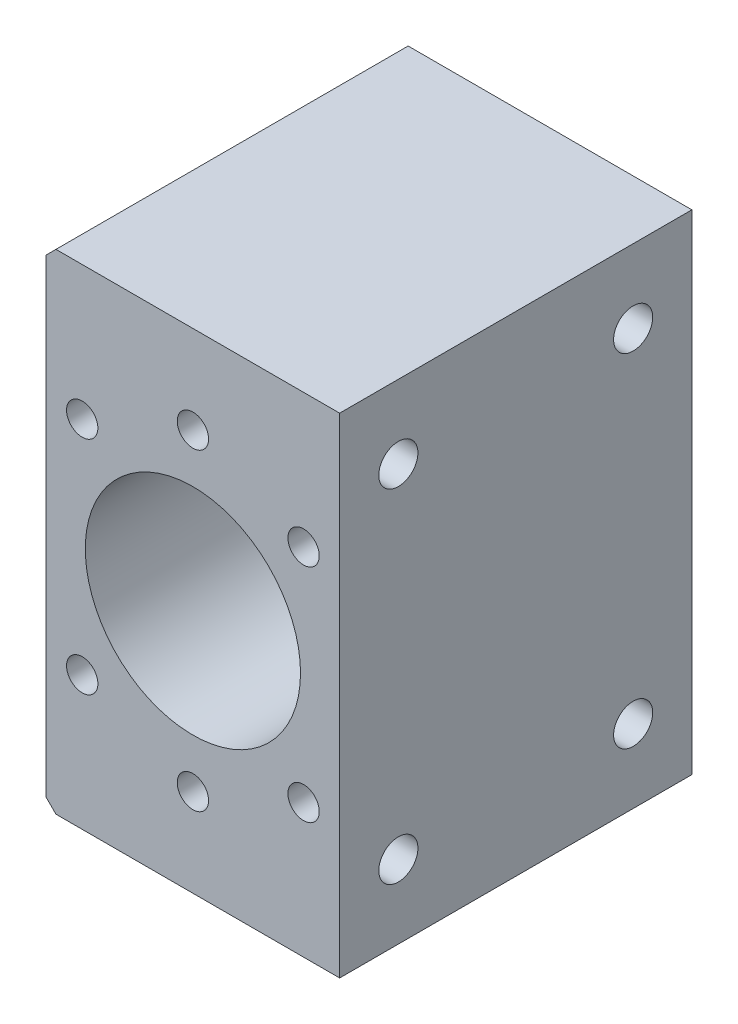
ISO-10303-21;
HEADER;
FILE_DESCRIPTION(('STEP AP214'),'2;1');
FILE_NAME('part.step','',(''),(''),'','','');
FILE_SCHEMA(('AUTOMOTIVE_DESIGN { 1 0 10303 214 1 1 1 1 }'));
ENDSEC;
DATA;
#1=APPLICATION_CONTEXT('core data for automotive mechanical design processes');
#2=APPLICATION_PROTOCOL_DEFINITION('international standard','automotive_design',2000,#1);
#3=PRODUCT_CONTEXT('',#1,'mechanical');
#4=PRODUCT('Part','Part','',(#3));
#5=PRODUCT_RELATED_PRODUCT_CATEGORY('part','',(#4));
#6=PRODUCT_DEFINITION_FORMATION('','',#4);
#7=PRODUCT_DEFINITION_CONTEXT('part definition',#1,'design');
#8=PRODUCT_DEFINITION('design','',#6,#7);
#9=PRODUCT_DEFINITION_SHAPE('','',#8);
#10=(LENGTH_UNIT() NAMED_UNIT(*) SI_UNIT(.MILLI.,.METRE.));
#11=(NAMED_UNIT(*) PLANE_ANGLE_UNIT() SI_UNIT($,.RADIAN.));
#12=(NAMED_UNIT(*) SI_UNIT($,.STERADIAN.) SOLID_ANGLE_UNIT());
#13=UNCERTAINTY_MEASURE_WITH_UNIT(LENGTH_MEASURE(1.E-05),#10,'distance_accuracy_value','');
#14=(GEOMETRIC_REPRESENTATION_CONTEXT(3) GLOBAL_UNCERTAINTY_ASSIGNED_CONTEXT((#13)) GLOBAL_UNIT_ASSIGNED_CONTEXT((#10,
#11,#12)) REPRESENTATION_CONTEXT('',''));
#15=CARTESIAN_POINT('',(0.,0.,0.));
#16=DIRECTION('',(0.,0.,1.));
#17=DIRECTION('',(1.,0.,0.));
#18=AXIS2_PLACEMENT_3D('',#15,#16,#17);
#19=CARTESIAN_POINT('',(-19.5,-19.5,36.));
#20=DIRECTION('',(-0.707106781186547,-0.707106781186547,0.));
#21=DIRECTION('',(0.707106781186548,-0.707106781186548,0.));
#22=AXIS2_PLACEMENT_3D('',#19,#20,#21);
#23=PLANE('',#22);
#24=DIRECTION('',(-0.707106781186548,0.707106781186548,0.));
#25=VECTOR('',#24,1.);
#26=CARTESIAN_POINT('',(-19.5,-19.5,0.));
#27=LINE('',#26,#25);
#28=CARTESIAN_POINT('',(-14.,-25.,0.));
#29=VERTEX_POINT('',#28);
#30=CARTESIAN_POINT('',(-15.,-24.,0.));
#31=VERTEX_POINT('',#30);
#32=EDGE_CURVE('E142',#29,#31,#27,.T.);
#33=ORIENTED_EDGE('',*,*,#32,.F.);
#34=DIRECTION('',(0.,0.,-1.));
#35=VECTOR('',#34,1.);
#36=CARTESIAN_POINT('',(-14.,-25.,36.));
#37=LINE('',#36,#35);
#38=CARTESIAN_POINT('',(-14.,-25.,36.));
#39=VERTEX_POINT('',#38);
#40=EDGE_CURVE('E11',#39,#29,#37,.T.);
#41=ORIENTED_EDGE('',*,*,#40,.F.);
#42=DIRECTION('',(-0.707106781186548,0.707106781186548,0.));
#43=VECTOR('',#42,1.);
#44=CARTESIAN_POINT('',(-19.5,-19.5,36.));
#45=LINE('',#44,#43);
#46=CARTESIAN_POINT('',(-15.,-24.,36.));
#47=VERTEX_POINT('',#46);
#48=EDGE_CURVE('E217',#39,#47,#45,.T.);
#49=ORIENTED_EDGE('',*,*,#48,.T.);
#50=DIRECTION('',(0.,0.,-1.));
#51=VECTOR('',#50,1.);
#52=CARTESIAN_POINT('',(-15.,-24.,36.));
#53=LINE('',#52,#51);
#54=EDGE_CURVE('E99',#47,#31,#53,.T.);
#55=ORIENTED_EDGE('',*,*,#54,.T.);
#56=EDGE_LOOP('',(#33,#41,#49,#55));
#57=FACE_BOUND('',#56,.T.);
#58=ADVANCED_FACE('F53',(#57),#23,.T.);
#59=CARTESIAN_POINT('',(0.,-25.,36.));
#60=DIRECTION('',(0.,1.,0.));
#61=DIRECTION('',(-1.,0.,0.));
#62=AXIS2_PLACEMENT_3D('',#59,#60,#61);
#63=PLANE('',#62);
#64=DIRECTION('',(1.,0.,0.));
#65=VECTOR('',#64,1.);
#66=CARTESIAN_POINT('',(0.,-25.,0.));
#67=LINE('',#66,#65);
#68=CARTESIAN_POINT('',(15.,-25.,0.));
#69=VERTEX_POINT('',#68);
#70=EDGE_CURVE('E145',#29,#69,#67,.T.);
#71=ORIENTED_EDGE('',*,*,#70,.T.);
#72=DIRECTION('',(0.,0.,-1.));
#73=VECTOR('',#72,1.);
#74=CARTESIAN_POINT('',(15.,-25.,36.));
#75=LINE('',#74,#73);
#76=CARTESIAN_POINT('',(15.,-25.,36.));
#77=VERTEX_POINT('',#76);
#78=EDGE_CURVE('E62',#77,#69,#75,.T.);
#79=ORIENTED_EDGE('',*,*,#78,.F.);
#80=DIRECTION('',(1.,0.,0.));
#81=VECTOR('',#80,1.);
#82=CARTESIAN_POINT('',(0.,-25.,36.));
#83=LINE('',#82,#81);
#84=EDGE_CURVE('E134',#39,#77,#83,.T.);
#85=ORIENTED_EDGE('',*,*,#84,.F.);
#86=ORIENTED_EDGE('',*,*,#40,.T.);
#87=EDGE_LOOP('',(#71,#79,#85,#86));
#88=FACE_BOUND('',#87,.T.);
#89=ADVANCED_FACE('F164',(#88),#63,.F.);
#90=CARTESIAN_POINT('',(15.,0.,36.));
#91=DIRECTION('',(1.,0.,0.));
#92=DIRECTION('',(0.,0.,-1.));
#93=AXIS2_PLACEMENT_3D('',#90,#91,#92);
#94=PLANE('',#93);
#95=CARTESIAN_POINT('',(15.,-17.5,5.99999999999999));
#96=DIRECTION('',(1.,0.,0.));
#97=DIRECTION('',(0.,0.,-1.));
#98=AXIS2_PLACEMENT_3D('',#95,#96,#97);
#99=CIRCLE('',#98,2.);
#100=CARTESIAN_POINT('',(15.,-17.5,3.99999999999999));
#101=VERTEX_POINT('',#100);
#102=EDGE_CURVE('E264',#101,#101,#99,.T.);
#103=ORIENTED_EDGE('',*,*,#102,.F.);
#104=EDGE_LOOP('',(#103));
#105=FACE_BOUND('',#104,.T.);
#106=CARTESIAN_POINT('',(15.,-17.5,30.));
#107=DIRECTION('',(1.,0.,0.));
#108=DIRECTION('',(0.,0.,-1.));
#109=AXIS2_PLACEMENT_3D('',#106,#107,#108);
#110=CIRCLE('',#109,2.);
#111=CARTESIAN_POINT('',(15.,-17.5,28.));
#112=VERTEX_POINT('',#111);
#113=EDGE_CURVE('E271',#112,#112,#110,.T.);
#114=ORIENTED_EDGE('',*,*,#113,.F.);
#115=EDGE_LOOP('',(#114));
#116=FACE_BOUND('',#115,.T.);
#117=CARTESIAN_POINT('',(15.,17.5,30.));
#118=DIRECTION('',(1.,0.,0.));
#119=DIRECTION('',(0.,0.,-1.));
#120=AXIS2_PLACEMENT_3D('',#117,#118,#119);
#121=CIRCLE('',#120,2.);
#122=CARTESIAN_POINT('',(15.,17.5,28.));
#123=VERTEX_POINT('',#122);
#124=EDGE_CURVE('E277',#123,#123,#121,.T.);
#125=ORIENTED_EDGE('',*,*,#124,.F.);
#126=EDGE_LOOP('',(#125));
#127=FACE_BOUND('',#126,.T.);
#128=CARTESIAN_POINT('',(15.,17.5,5.99999999999999));
#129=DIRECTION('',(1.,0.,0.));
#130=DIRECTION('',(0.,0.,-1.));
#131=AXIS2_PLACEMENT_3D('',#128,#129,#130);
#132=CIRCLE('',#131,2.);
#133=CARTESIAN_POINT('',(15.,17.5,3.99999999999999));
#134=VERTEX_POINT('',#133);
#135=EDGE_CURVE('E258',#134,#134,#132,.T.);
#136=ORIENTED_EDGE('',*,*,#135,.F.);
#137=EDGE_LOOP('',(#136));
#138=FACE_BOUND('',#137,.T.);
#139=DIRECTION('',(0.,-1.,0.));
#140=VECTOR('',#139,1.);
#141=CARTESIAN_POINT('',(15.,0.,0.));
#142=LINE('',#141,#140);
#143=CARTESIAN_POINT('',(15.,25.,0.));
#144=VERTEX_POINT('',#143);
#145=EDGE_CURVE('E148',#144,#69,#142,.T.);
#146=ORIENTED_EDGE('',*,*,#145,.F.);
#147=DIRECTION('',(0.,0.,-1.));
#148=VECTOR('',#147,1.);
#149=CARTESIAN_POINT('',(15.,25.,36.));
#150=LINE('',#149,#148);
#151=CARTESIAN_POINT('',(15.,25.,36.));
#152=VERTEX_POINT('',#151);
#153=EDGE_CURVE('E122',#152,#144,#150,.T.);
#154=ORIENTED_EDGE('',*,*,#153,.F.);
#155=DIRECTION('',(0.,-1.,0.));
#156=VECTOR('',#155,1.);
#157=CARTESIAN_POINT('',(15.,0.,36.));
#158=LINE('',#157,#156);
#159=EDGE_CURVE('E132',#152,#77,#158,.T.);
#160=ORIENTED_EDGE('',*,*,#159,.T.);
#161=ORIENTED_EDGE('',*,*,#78,.T.);
#162=EDGE_LOOP('',(#146,#154,#160,#161));
#163=FACE_BOUND('',#162,.T.);
#164=ADVANCED_FACE('F161',(#105,#116,#127,#138,#163),#94,.T.);
#165=CARTESIAN_POINT('',(0.,25.,36.));
#166=DIRECTION('',(0.,1.,0.));
#167=DIRECTION('',(-1.,0.,0.));
#168=AXIS2_PLACEMENT_3D('',#165,#166,#167);
#169=PLANE('',#168);
#170=DIRECTION('',(1.,0.,0.));
#171=VECTOR('',#170,1.);
#172=CARTESIAN_POINT('',(0.,25.,0.));
#173=LINE('',#172,#171);
#174=CARTESIAN_POINT('',(-14.,25.,0.));
#175=VERTEX_POINT('',#174);
#176=EDGE_CURVE('E119',#175,#144,#173,.T.);
#177=ORIENTED_EDGE('',*,*,#176,.F.);
#178=DIRECTION('',(0.,0.,-1.));
#179=VECTOR('',#178,1.);
#180=CARTESIAN_POINT('',(-14.,25.,36.));
#181=LINE('',#180,#179);
#182=CARTESIAN_POINT('',(-14.,25.,36.));
#183=VERTEX_POINT('',#182);
#184=EDGE_CURVE('E113',#183,#175,#181,.T.);
#185=ORIENTED_EDGE('',*,*,#184,.F.);
#186=DIRECTION('',(1.,0.,0.));
#187=VECTOR('',#186,1.);
#188=CARTESIAN_POINT('',(0.,25.,36.));
#189=LINE('',#188,#187);
#190=EDGE_CURVE('E117',#183,#152,#189,.T.);
#191=ORIENTED_EDGE('',*,*,#190,.T.);
#192=ORIENTED_EDGE('',*,*,#153,.T.);
#193=EDGE_LOOP('',(#177,#185,#191,#192));
#194=FACE_BOUND('',#193,.T.);
#195=ADVANCED_FACE('F115',(#194),#169,.T.);
#196=CARTESIAN_POINT('',(-19.5,19.5,36.));
#197=DIRECTION('',(0.707106781186547,-0.707106781186547,0.));
#198=DIRECTION('',(0.707106781186548,0.707106781186548,0.));
#199=AXIS2_PLACEMENT_3D('',#196,#197,#198);
#200=PLANE('',#199);
#201=DIRECTION('',(-0.707106781186548,-0.707106781186548,0.));
#202=VECTOR('',#201,1.);
#203=CARTESIAN_POINT('',(-19.5,19.5,0.));
#204=LINE('',#203,#202);
#205=CARTESIAN_POINT('',(-15.,24.,0.));
#206=VERTEX_POINT('',#205);
#207=EDGE_CURVE('E152',#175,#206,#204,.T.);
#208=ORIENTED_EDGE('',*,*,#207,.T.);
#209=DIRECTION('',(0.,0.,-1.));
#210=VECTOR('',#209,1.);
#211=CARTESIAN_POINT('',(-15.,24.,36.));
#212=LINE('',#211,#210);
#213=CARTESIAN_POINT('',(-15.,24.,36.));
#214=VERTEX_POINT('',#213);
#215=EDGE_CURVE('E123',#214,#206,#212,.T.);
#216=ORIENTED_EDGE('',*,*,#215,.F.);
#217=DIRECTION('',(-0.707106781186548,-0.707106781186548,0.));
#218=VECTOR('',#217,1.);
#219=CARTESIAN_POINT('',(-19.5,19.5,36.));
#220=LINE('',#219,#218);
#221=EDGE_CURVE('E126',#183,#214,#220,.T.);
#222=ORIENTED_EDGE('',*,*,#221,.F.);
#223=ORIENTED_EDGE('',*,*,#184,.T.);
#224=EDGE_LOOP('',(#208,#216,#222,#223));
#225=FACE_BOUND('',#224,.T.);
#226=ADVANCED_FACE('F127',(#225),#200,.F.);
#227=CARTESIAN_POINT('',(0.,0.,36.));
#228=DIRECTION('',(0.,0.,-1.));
#229=DIRECTION('',(-1.,0.,0.));
#230=AXIS2_PLACEMENT_3D('',#227,#228,#229);
#231=CYLINDRICAL_SURFACE('',#230,11.);
#232=CARTESIAN_POINT('',(0.,0.,36.));
#233=DIRECTION('',(0.,0.,1.));
#234=DIRECTION('',(1.,0.,0.));
#235=AXIS2_PLACEMENT_3D('',#232,#233,#234);
#236=CIRCLE('',#235,11.);
#237=CARTESIAN_POINT('',(11.,0.,36.));
#238=VERTEX_POINT('',#237);
#239=EDGE_CURVE('E155',#238,#238,#236,.T.);
#240=ORIENTED_EDGE('',*,*,#239,.T.);
#241=EDGE_LOOP('',(#240));
#242=FACE_BOUND('',#241,.T.);
#243=CARTESIAN_POINT('',(0.,0.,0.));
#244=DIRECTION('',(0.,0.,1.));
#245=DIRECTION('',(1.,0.,0.));
#246=AXIS2_PLACEMENT_3D('',#243,#244,#245);
#247=CIRCLE('',#246,11.);
#248=CARTESIAN_POINT('',(11.,0.,0.));
#249=VERTEX_POINT('',#248);
#250=EDGE_CURVE('E139',#249,#249,#247,.T.);
#251=ORIENTED_EDGE('',*,*,#250,.F.);
#252=EDGE_LOOP('',(#251));
#253=FACE_BOUND('',#252,.T.);
#254=ADVANCED_FACE('F55',(#242,#253),#231,.F.);
#255=CARTESIAN_POINT('',(-15.,0.,36.));
#256=DIRECTION('',(1.,0.,0.));
#257=DIRECTION('',(0.,0.,-1.));
#258=AXIS2_PLACEMENT_3D('',#255,#256,#257);
#259=PLANE('',#258);
#260=CARTESIAN_POINT('',(-15.,17.5,30.));
#261=DIRECTION('',(-1.,0.,0.));
#262=DIRECTION('',(0.,0.,1.));
#263=AXIS2_PLACEMENT_3D('',#260,#261,#262);
#264=CIRCLE('',#263,1.2);
#265=CARTESIAN_POINT('',(-15.,17.5,31.2));
#266=VERTEX_POINT('',#265);
#267=EDGE_CURVE('E204',#266,#266,#264,.T.);
#268=ORIENTED_EDGE('',*,*,#267,.F.);
#269=EDGE_LOOP('',(#268));
#270=FACE_BOUND('',#269,.T.);
#271=CARTESIAN_POINT('',(-15.,-17.5,5.99999999999999));
#272=DIRECTION('',(-1.,0.,0.));
#273=DIRECTION('',(0.,0.,1.));
#274=AXIS2_PLACEMENT_3D('',#271,#272,#273);
#275=CIRCLE('',#274,1.2);
#276=CARTESIAN_POINT('',(-15.,-17.5,7.19999999999999));
#277=VERTEX_POINT('',#276);
#278=EDGE_CURVE('E208',#277,#277,#275,.T.);
#279=ORIENTED_EDGE('',*,*,#278,.F.);
#280=EDGE_LOOP('',(#279));
#281=FACE_BOUND('',#280,.T.);
#282=CARTESIAN_POINT('',(-15.,-17.5,30.));
#283=DIRECTION('',(-1.,0.,0.));
#284=DIRECTION('',(0.,0.,1.));
#285=AXIS2_PLACEMENT_3D('',#282,#283,#284);
#286=CIRCLE('',#285,1.2);
#287=CARTESIAN_POINT('',(-15.,-17.5,31.2));
#288=VERTEX_POINT('',#287);
#289=EDGE_CURVE('E212',#288,#288,#286,.T.);
#290=ORIENTED_EDGE('',*,*,#289,.F.);
#291=EDGE_LOOP('',(#290));
#292=FACE_BOUND('',#291,.T.);
#293=CARTESIAN_POINT('',(-15.,17.5,5.99999999999999));
#294=DIRECTION('',(-1.,0.,0.));
#295=DIRECTION('',(0.,0.,1.));
#296=AXIS2_PLACEMENT_3D('',#293,#294,#295);
#297=CIRCLE('',#296,1.2);
#298=CARTESIAN_POINT('',(-15.,17.5,7.19999999999999));
#299=VERTEX_POINT('',#298);
#300=EDGE_CURVE('E216',#299,#299,#297,.T.);
#301=ORIENTED_EDGE('',*,*,#300,.F.);
#302=EDGE_LOOP('',(#301));
#303=FACE_BOUND('',#302,.T.);
#304=DIRECTION('',(0.,-1.,0.));
#305=VECTOR('',#304,1.);
#306=CARTESIAN_POINT('',(-15.,0.,0.));
#307=LINE('',#306,#305);
#308=EDGE_CURVE('E92',#206,#31,#307,.T.);
#309=ORIENTED_EDGE('',*,*,#308,.T.);
#310=ORIENTED_EDGE('',*,*,#54,.F.);
#311=DIRECTION('',(0.,-1.,0.));
#312=VECTOR('',#311,1.);
#313=CARTESIAN_POINT('',(-15.,0.,36.));
#314=LINE('',#313,#312);
#315=EDGE_CURVE('E70',#214,#47,#314,.T.);
#316=ORIENTED_EDGE('',*,*,#315,.F.);
#317=ORIENTED_EDGE('',*,*,#215,.T.);
#318=EDGE_LOOP('',(#309,#310,#316,#317));
#319=FACE_BOUND('',#318,.T.);
#320=ADVANCED_FACE('F178',(#270,#281,#292,#303,#319),#259,.F.);
#321=CARTESIAN_POINT('',(0.,0.,36.));
#322=DIRECTION('',(0.,0.,1.));
#323=DIRECTION('',(1.,0.,0.));
#324=AXIS2_PLACEMENT_3D('',#321,#322,#323);
#325=PLANE('',#324);
#326=CARTESIAN_POINT('',(0.,16.,36.));
#327=DIRECTION('',(0.,0.,1.));
#328=DIRECTION('',(1.,0.,0.));
#329=AXIS2_PLACEMENT_3D('',#326,#327,#328);
#330=CIRCLE('',#329,1.6);
#331=CARTESIAN_POINT('',(1.6,16.,36.));
#332=VERTEX_POINT('',#331);
#333=EDGE_CURVE('E247',#332,#332,#330,.T.);
#334=ORIENTED_EDGE('',*,*,#333,.F.);
#335=EDGE_LOOP('',(#334));
#336=FACE_BOUND('',#335,.T.);
#337=CARTESIAN_POINT('',(-11.3137084989848,11.3137084989848,36.));
#338=DIRECTION('',(0.,0.,1.));
#339=DIRECTION('',(1.,0.,0.));
#340=AXIS2_PLACEMENT_3D('',#337,#338,#339);
#341=CIRCLE('',#340,1.6);
#342=CARTESIAN_POINT('',(-9.71370849898476,11.3137084989848,36.));
#343=VERTEX_POINT('',#342);
#344=EDGE_CURVE('E248',#343,#343,#341,.T.);
#345=ORIENTED_EDGE('',*,*,#344,.F.);
#346=EDGE_LOOP('',(#345));
#347=FACE_BOUND('',#346,.T.);
#348=CARTESIAN_POINT('',(-11.3137084989848,-11.3137084989848,36.));
#349=DIRECTION('',(0.,0.,1.));
#350=DIRECTION('',(1.,0.,0.));
#351=AXIS2_PLACEMENT_3D('',#348,#349,#350);
#352=CIRCLE('',#351,1.6);
#353=CARTESIAN_POINT('',(-9.71370849898476,-11.3137084989848,36.));
#354=VERTEX_POINT('',#353);
#355=EDGE_CURVE('E222',#354,#354,#352,.T.);
#356=ORIENTED_EDGE('',*,*,#355,.F.);
#357=EDGE_LOOP('',(#356));
#358=FACE_BOUND('',#357,.T.);
#359=CARTESIAN_POINT('',(0.,-16.,36.));
#360=DIRECTION('',(0.,0.,1.));
#361=DIRECTION('',(1.,0.,0.));
#362=AXIS2_PLACEMENT_3D('',#359,#360,#361);
#363=CIRCLE('',#362,1.6);
#364=CARTESIAN_POINT('',(1.6,-16.,36.));
#365=VERTEX_POINT('',#364);
#366=EDGE_CURVE('E229',#365,#365,#363,.T.);
#367=ORIENTED_EDGE('',*,*,#366,.F.);
#368=EDGE_LOOP('',(#367));
#369=FACE_BOUND('',#368,.T.);
#370=CARTESIAN_POINT('',(11.3137084989848,-11.3137084989848,36.));
#371=DIRECTION('',(0.,0.,1.));
#372=DIRECTION('',(1.,0.,0.));
#373=AXIS2_PLACEMENT_3D('',#370,#371,#372);
#374=CIRCLE('',#373,1.6);
#375=CARTESIAN_POINT('',(12.9137084989848,-11.3137084989848,36.));
#376=VERTEX_POINT('',#375);
#377=EDGE_CURVE('E235',#376,#376,#374,.T.);
#378=ORIENTED_EDGE('',*,*,#377,.F.);
#379=EDGE_LOOP('',(#378));
#380=FACE_BOUND('',#379,.T.);
#381=CARTESIAN_POINT('',(11.3137084989848,11.3137084989848,36.));
#382=DIRECTION('',(0.,0.,1.));
#383=DIRECTION('',(1.,0.,0.));
#384=AXIS2_PLACEMENT_3D('',#381,#382,#383);
#385=CIRCLE('',#384,1.6);
#386=CARTESIAN_POINT('',(12.9137084989848,11.3137084989848,36.));
#387=VERTEX_POINT('',#386);
#388=EDGE_CURVE('E241',#387,#387,#385,.T.);
#389=ORIENTED_EDGE('',*,*,#388,.F.);
#390=EDGE_LOOP('',(#389));
#391=FACE_BOUND('',#390,.T.);
#392=ORIENTED_EDGE('',*,*,#239,.F.);
#393=EDGE_LOOP('',(#392));
#394=FACE_BOUND('',#393,.T.);
#395=ORIENTED_EDGE('',*,*,#48,.F.);
#396=ORIENTED_EDGE('',*,*,#84,.T.);
#397=ORIENTED_EDGE('',*,*,#159,.F.);
#398=ORIENTED_EDGE('',*,*,#190,.F.);
#399=ORIENTED_EDGE('',*,*,#221,.T.);
#400=ORIENTED_EDGE('',*,*,#315,.T.);
#401=EDGE_LOOP('',(#395,#396,#397,#398,#399,#400));
#402=FACE_BOUND('',#401,.T.);
#403=ADVANCED_FACE('F130',(#336,#347,#358,#369,#380,#391,#394,#402),#325,.T.);
#404=CARTESIAN_POINT('',(0.,0.,0.));
#405=DIRECTION('',(0.,0.,1.));
#406=DIRECTION('',(1.,0.,0.));
#407=AXIS2_PLACEMENT_3D('',#404,#405,#406);
#408=PLANE('',#407);
#409=ORIENTED_EDGE('',*,*,#250,.T.);
#410=EDGE_LOOP('',(#409));
#411=FACE_BOUND('',#410,.T.);
#412=ORIENTED_EDGE('',*,*,#32,.T.);
#413=ORIENTED_EDGE('',*,*,#308,.F.);
#414=ORIENTED_EDGE('',*,*,#207,.F.);
#415=ORIENTED_EDGE('',*,*,#176,.T.);
#416=ORIENTED_EDGE('',*,*,#145,.T.);
#417=ORIENTED_EDGE('',*,*,#70,.F.);
#418=EDGE_LOOP('',(#412,#413,#414,#415,#416,#417));
#419=FACE_BOUND('',#418,.T.);
#420=ADVANCED_FACE('F165',(#411,#419),#408,.F.);
#421=CARTESIAN_POINT('',(11.3137084989848,11.3137084989848,26.));
#422=DIRECTION('',(0.,0.,1.));
#423=DIRECTION('',(1.,0.,0.));
#424=AXIS2_PLACEMENT_3D('',#421,#422,#423);
#425=CYLINDRICAL_SURFACE('',#424,1.6);
#426=CARTESIAN_POINT('',(11.3137084989848,11.3137084989848,26.));
#427=DIRECTION('',(0.,0.,1.));
#428=DIRECTION('',(1.,0.,0.));
#429=AXIS2_PLACEMENT_3D('',#426,#427,#428);
#430=CIRCLE('',#429,1.6);
#431=CARTESIAN_POINT('',(12.9137084989848,11.3137084989848,26.));
#432=VERTEX_POINT('',#431);
#433=EDGE_CURVE('E244',#432,#432,#430,.T.);
#434=ORIENTED_EDGE('',*,*,#433,.F.);
#435=EDGE_LOOP('',(#434));
#436=FACE_BOUND('',#435,.T.);
#437=ORIENTED_EDGE('',*,*,#388,.T.);
#438=EDGE_LOOP('',(#437));
#439=FACE_BOUND('',#438,.T.);
#440=ADVANCED_FACE('F167',(#436,#439),#425,.F.);
#441=CARTESIAN_POINT('',(11.3137084989848,11.3137084989848,26.));
#442=DIRECTION('',(0.,0.,1.));
#443=DIRECTION('',(1.,0.,0.));
#444=AXIS2_PLACEMENT_3D('',#441,#442,#443);
#445=PLANE('',#444);
#446=ORIENTED_EDGE('',*,*,#433,.T.);
#447=EDGE_LOOP('',(#446));
#448=FACE_BOUND('',#447,.T.);
#449=ADVANCED_FACE('F175',(#448),#445,.T.);
#450=CARTESIAN_POINT('',(11.3137084989848,-11.3137084989848,26.));
#451=DIRECTION('',(0.,0.,1.));
#452=DIRECTION('',(1.,0.,0.));
#453=AXIS2_PLACEMENT_3D('',#450,#451,#452);
#454=CYLINDRICAL_SURFACE('',#453,1.6);
#455=CARTESIAN_POINT('',(11.3137084989848,-11.3137084989848,26.));
#456=DIRECTION('',(0.,0.,1.));
#457=DIRECTION('',(1.,0.,0.));
#458=AXIS2_PLACEMENT_3D('',#455,#456,#457);
#459=CIRCLE('',#458,1.6);
#460=CARTESIAN_POINT('',(12.9137084989848,-11.3137084989848,26.));
#461=VERTEX_POINT('',#460);
#462=EDGE_CURVE('E238',#461,#461,#459,.T.);
#463=ORIENTED_EDGE('',*,*,#462,.F.);
#464=EDGE_LOOP('',(#463));
#465=FACE_BOUND('',#464,.T.);
#466=ORIENTED_EDGE('',*,*,#377,.T.);
#467=EDGE_LOOP('',(#466));
#468=FACE_BOUND('',#467,.T.);
#469=ADVANCED_FACE('F382',(#465,#468),#454,.F.);
#470=CARTESIAN_POINT('',(11.3137084989848,-11.3137084989848,26.));
#471=DIRECTION('',(0.,0.,1.));
#472=DIRECTION('',(1.,0.,0.));
#473=AXIS2_PLACEMENT_3D('',#470,#471,#472);
#474=PLANE('',#473);
#475=ORIENTED_EDGE('',*,*,#462,.T.);
#476=EDGE_LOOP('',(#475));
#477=FACE_BOUND('',#476,.T.);
#478=ADVANCED_FACE('F385',(#477),#474,.T.);
#479=CARTESIAN_POINT('',(0.,-16.,26.));
#480=DIRECTION('',(0.,0.,1.));
#481=DIRECTION('',(1.,0.,0.));
#482=AXIS2_PLACEMENT_3D('',#479,#480,#481);
#483=CYLINDRICAL_SURFACE('',#482,1.6);
#484=CARTESIAN_POINT('',(0.,-16.,26.));
#485=DIRECTION('',(0.,0.,1.));
#486=DIRECTION('',(1.,0.,0.));
#487=AXIS2_PLACEMENT_3D('',#484,#485,#486);
#488=CIRCLE('',#487,1.6);
#489=CARTESIAN_POINT('',(1.6,-16.,26.));
#490=VERTEX_POINT('',#489);
#491=EDGE_CURVE('E232',#490,#490,#488,.T.);
#492=ORIENTED_EDGE('',*,*,#491,.F.);
#493=EDGE_LOOP('',(#492));
#494=FACE_BOUND('',#493,.T.);
#495=ORIENTED_EDGE('',*,*,#366,.T.);
#496=EDGE_LOOP('',(#495));
#497=FACE_BOUND('',#496,.T.);
#498=ADVANCED_FACE('F388',(#494,#497),#483,.F.);
#499=CARTESIAN_POINT('',(0.,-16.,26.));
#500=DIRECTION('',(0.,0.,1.));
#501=DIRECTION('',(1.,0.,0.));
#502=AXIS2_PLACEMENT_3D('',#499,#500,#501);
#503=PLANE('',#502);
#504=ORIENTED_EDGE('',*,*,#491,.T.);
#505=EDGE_LOOP('',(#504));
#506=FACE_BOUND('',#505,.T.);
#507=ADVANCED_FACE('F393',(#506),#503,.T.);
#508=CARTESIAN_POINT('',(-11.3137084989848,-11.3137084989848,26.));
#509=DIRECTION('',(0.,0.,1.));
#510=DIRECTION('',(1.,0.,0.));
#511=AXIS2_PLACEMENT_3D('',#508,#509,#510);
#512=CYLINDRICAL_SURFACE('',#511,1.6);
#513=CARTESIAN_POINT('',(-11.3137084989848,-11.3137084989848,26.));
#514=DIRECTION('',(0.,0.,1.));
#515=DIRECTION('',(1.,0.,0.));
#516=AXIS2_PLACEMENT_3D('',#513,#514,#515);
#517=CIRCLE('',#516,1.6);
#518=CARTESIAN_POINT('',(-9.71370849898476,-11.3137084989848,26.));
#519=VERTEX_POINT('',#518);
#520=EDGE_CURVE('E225',#519,#519,#517,.T.);
#521=ORIENTED_EDGE('',*,*,#520,.F.);
#522=EDGE_LOOP('',(#521));
#523=FACE_BOUND('',#522,.T.);
#524=ORIENTED_EDGE('',*,*,#355,.T.);
#525=EDGE_LOOP('',(#524));
#526=FACE_BOUND('',#525,.T.);
#527=ADVANCED_FACE('F396',(#523,#526),#512,.F.);
#528=CARTESIAN_POINT('',(-11.3137084989848,-11.3137084989848,26.));
#529=DIRECTION('',(0.,0.,1.));
#530=DIRECTION('',(1.,0.,0.));
#531=AXIS2_PLACEMENT_3D('',#528,#529,#530);
#532=PLANE('',#531);
#533=ORIENTED_EDGE('',*,*,#520,.T.);
#534=EDGE_LOOP('',(#533));
#535=FACE_BOUND('',#534,.T.);
#536=ADVANCED_FACE('F379',(#535),#532,.T.);
#537=CARTESIAN_POINT('',(-11.3137084989848,11.3137084989848,26.));
#538=DIRECTION('',(0.,0.,1.));
#539=DIRECTION('',(1.,0.,0.));
#540=AXIS2_PLACEMENT_3D('',#537,#538,#539);
#541=CYLINDRICAL_SURFACE('',#540,1.6);
#542=CARTESIAN_POINT('',(-11.3137084989848,11.3137084989848,26.));
#543=DIRECTION('',(0.,0.,1.));
#544=DIRECTION('',(1.,0.,0.));
#545=AXIS2_PLACEMENT_3D('',#542,#543,#544);
#546=CIRCLE('',#545,1.6);
#547=CARTESIAN_POINT('',(-9.71370849898476,11.3137084989848,26.));
#548=VERTEX_POINT('',#547);
#549=EDGE_CURVE('E226',#548,#548,#546,.T.);
#550=ORIENTED_EDGE('',*,*,#549,.F.);
#551=EDGE_LOOP('',(#550));
#552=FACE_BOUND('',#551,.T.);
#553=ORIENTED_EDGE('',*,*,#344,.T.);
#554=EDGE_LOOP('',(#553));
#555=FACE_BOUND('',#554,.T.);
#556=ADVANCED_FACE('F375',(#552,#555),#541,.F.);
#557=CARTESIAN_POINT('',(-11.3137084989848,11.3137084989848,26.));
#558=DIRECTION('',(0.,0.,1.));
#559=DIRECTION('',(1.,0.,0.));
#560=AXIS2_PLACEMENT_3D('',#557,#558,#559);
#561=PLANE('',#560);
#562=ORIENTED_EDGE('',*,*,#549,.T.);
#563=EDGE_LOOP('',(#562));
#564=FACE_BOUND('',#563,.T.);
#565=ADVANCED_FACE('F371',(#564),#561,.T.);
#566=CARTESIAN_POINT('',(0.,16.,26.));
#567=DIRECTION('',(0.,0.,1.));
#568=DIRECTION('',(1.,0.,0.));
#569=AXIS2_PLACEMENT_3D('',#566,#567,#568);
#570=CYLINDRICAL_SURFACE('',#569,1.6);
#571=CARTESIAN_POINT('',(0.,16.,26.));
#572=DIRECTION('',(0.,0.,1.));
#573=DIRECTION('',(1.,0.,0.));
#574=AXIS2_PLACEMENT_3D('',#571,#572,#573);
#575=CIRCLE('',#574,1.6);
#576=CARTESIAN_POINT('',(1.6,16.,26.));
#577=VERTEX_POINT('',#576);
#578=EDGE_CURVE('E143',#577,#577,#575,.T.);
#579=ORIENTED_EDGE('',*,*,#578,.F.);
#580=EDGE_LOOP('',(#579));
#581=FACE_BOUND('',#580,.T.);
#582=ORIENTED_EDGE('',*,*,#333,.T.);
#583=EDGE_LOOP('',(#582));
#584=FACE_BOUND('',#583,.T.);
#585=ADVANCED_FACE('F367',(#581,#584),#570,.F.);
#586=CARTESIAN_POINT('',(0.,16.,26.));
#587=DIRECTION('',(0.,0.,1.));
#588=DIRECTION('',(1.,0.,0.));
#589=AXIS2_PLACEMENT_3D('',#586,#587,#588);
#590=PLANE('',#589);
#591=ORIENTED_EDGE('',*,*,#578,.T.);
#592=EDGE_LOOP('',(#591));
#593=FACE_BOUND('',#592,.T.);
#594=ADVANCED_FACE('F363',(#593),#590,.T.);
#595=CARTESIAN_POINT('',(5.,17.5,5.99999999999999));
#596=DIRECTION('',(1.,0.,0.));
#597=DIRECTION('',(0.,0.,-1.));
#598=AXIS2_PLACEMENT_3D('',#595,#596,#597);
#599=CYLINDRICAL_SURFACE('',#598,2.);
#600=CARTESIAN_POINT('',(5.,17.5,5.99999999999999));
#601=DIRECTION('',(1.,0.,0.));
#602=DIRECTION('',(0.,0.,-1.));
#603=AXIS2_PLACEMENT_3D('',#600,#601,#602);
#604=CIRCLE('',#603,2.);
#605=CARTESIAN_POINT('',(5.,17.5,3.99999999999999));
#606=VERTEX_POINT('',#605);
#607=EDGE_CURVE('E251',#606,#606,#604,.T.);
#608=ORIENTED_EDGE('',*,*,#607,.F.);
#609=EDGE_LOOP('',(#608));
#610=FACE_BOUND('',#609,.T.);
#611=ORIENTED_EDGE('',*,*,#135,.T.);
#612=EDGE_LOOP('',(#611));
#613=FACE_BOUND('',#612,.T.);
#614=ADVANCED_FACE('F359',(#610,#613),#599,.F.);
#615=CARTESIAN_POINT('',(5.,17.5,5.99999999999999));
#616=DIRECTION('',(1.,0.,0.));
#617=DIRECTION('',(0.,0.,-1.));
#618=AXIS2_PLACEMENT_3D('',#615,#616,#617);
#619=PLANE('',#618);
#620=ORIENTED_EDGE('',*,*,#607,.T.);
#621=EDGE_LOOP('',(#620));
#622=FACE_BOUND('',#621,.T.);
#623=ADVANCED_FACE('F342',(#622),#619,.T.);
#624=CARTESIAN_POINT('',(5.,17.5,30.));
#625=DIRECTION('',(1.,0.,0.));
#626=DIRECTION('',(0.,0.,-1.));
#627=AXIS2_PLACEMENT_3D('',#624,#625,#626);
#628=CYLINDRICAL_SURFACE('',#627,2.);
#629=CARTESIAN_POINT('',(5.,17.5,30.));
#630=DIRECTION('',(1.,0.,0.));
#631=DIRECTION('',(0.,0.,-1.));
#632=AXIS2_PLACEMENT_3D('',#629,#630,#631);
#633=CIRCLE('',#632,2.);
#634=CARTESIAN_POINT('',(5.,17.5,28.));
#635=VERTEX_POINT('',#634);
#636=EDGE_CURVE('E261',#635,#635,#633,.T.);
#637=ORIENTED_EDGE('',*,*,#636,.F.);
#638=EDGE_LOOP('',(#637));
#639=FACE_BOUND('',#638,.T.);
#640=ORIENTED_EDGE('',*,*,#124,.T.);
#641=EDGE_LOOP('',(#640));
#642=FACE_BOUND('',#641,.T.);
#643=ADVANCED_FACE('F338',(#639,#642),#628,.F.);
#644=CARTESIAN_POINT('',(5.,17.5,30.));
#645=DIRECTION('',(1.,0.,0.));
#646=DIRECTION('',(0.,0.,-1.));
#647=AXIS2_PLACEMENT_3D('',#644,#645,#646);
#648=PLANE('',#647);
#649=ORIENTED_EDGE('',*,*,#636,.T.);
#650=EDGE_LOOP('',(#649));
#651=FACE_BOUND('',#650,.T.);
#652=ADVANCED_FACE('F334',(#651),#648,.T.);
#653=CARTESIAN_POINT('',(5.,-17.5,30.));
#654=DIRECTION('',(1.,0.,0.));
#655=DIRECTION('',(0.,0.,-1.));
#656=AXIS2_PLACEMENT_3D('',#653,#654,#655);
#657=CYLINDRICAL_SURFACE('',#656,2.);
#658=CARTESIAN_POINT('',(5.,-17.5,30.));
#659=DIRECTION('',(1.,0.,0.));
#660=DIRECTION('',(0.,0.,-1.));
#661=AXIS2_PLACEMENT_3D('',#658,#659,#660);
#662=CIRCLE('',#661,2.);
#663=CARTESIAN_POINT('',(5.,-17.5,28.));
#664=VERTEX_POINT('',#663);
#665=EDGE_CURVE('E274',#664,#664,#662,.T.);
#666=ORIENTED_EDGE('',*,*,#665,.F.);
#667=EDGE_LOOP('',(#666));
#668=FACE_BOUND('',#667,.T.);
#669=ORIENTED_EDGE('',*,*,#113,.T.);
#670=EDGE_LOOP('',(#669));
#671=FACE_BOUND('',#670,.T.);
#672=ADVANCED_FACE('F337',(#668,#671),#657,.F.);
#673=CARTESIAN_POINT('',(5.,-17.5,30.));
#674=DIRECTION('',(1.,0.,0.));
#675=DIRECTION('',(0.,0.,-1.));
#676=AXIS2_PLACEMENT_3D('',#673,#674,#675);
#677=PLANE('',#676);
#678=ORIENTED_EDGE('',*,*,#665,.T.);
#679=EDGE_LOOP('',(#678));
#680=FACE_BOUND('',#679,.T.);
#681=ADVANCED_FACE('F344',(#680),#677,.T.);
#682=CARTESIAN_POINT('',(5.,-17.5,5.99999999999999));
#683=DIRECTION('',(1.,0.,0.));
#684=DIRECTION('',(0.,0.,-1.));
#685=AXIS2_PLACEMENT_3D('',#682,#683,#684);
#686=CYLINDRICAL_SURFACE('',#685,2.);
#687=CARTESIAN_POINT('',(5.,-17.5,5.99999999999999));
#688=DIRECTION('',(1.,0.,0.));
#689=DIRECTION('',(0.,0.,-1.));
#690=AXIS2_PLACEMENT_3D('',#687,#688,#689);
#691=CIRCLE('',#690,2.);
#692=CARTESIAN_POINT('',(5.,-17.5,3.99999999999999));
#693=VERTEX_POINT('',#692);
#694=EDGE_CURVE('E267',#693,#693,#691,.T.);
#695=ORIENTED_EDGE('',*,*,#694,.F.);
#696=EDGE_LOOP('',(#695));
#697=FACE_BOUND('',#696,.T.);
#698=ORIENTED_EDGE('',*,*,#102,.T.);
#699=EDGE_LOOP('',(#698));
#700=FACE_BOUND('',#699,.T.);
#701=ADVANCED_FACE('F347',(#697,#700),#686,.F.);
#702=CARTESIAN_POINT('',(5.,-17.5,5.99999999999999));
#703=DIRECTION('',(1.,0.,0.));
#704=DIRECTION('',(0.,0.,-1.));
#705=AXIS2_PLACEMENT_3D('',#702,#703,#704);
#706=PLANE('',#705);
#707=ORIENTED_EDGE('',*,*,#694,.T.);
#708=EDGE_LOOP('',(#707));
#709=FACE_BOUND('',#708,.T.);
#710=ADVANCED_FACE('F332',(#709),#706,.T.);
#711=CARTESIAN_POINT('',(-10.,17.5,5.99999999999999));
#712=DIRECTION('',(-1.,0.,0.));
#713=DIRECTION('',(0.,0.,1.));
#714=AXIS2_PLACEMENT_3D('',#711,#712,#713);
#715=CYLINDRICAL_SURFACE('',#714,1.2);
#716=CARTESIAN_POINT('',(-10.,17.5,5.99999999999999));
#717=DIRECTION('',(-1.,0.,0.));
#718=DIRECTION('',(0.,0.,1.));
#719=AXIS2_PLACEMENT_3D('',#716,#717,#718);
#720=CIRCLE('',#719,1.2);
#721=CARTESIAN_POINT('',(-10.,17.5,7.19999999999999));
#722=VERTEX_POINT('',#721);
#723=EDGE_CURVE('E268',#722,#722,#720,.T.);
#724=ORIENTED_EDGE('',*,*,#723,.F.);
#725=EDGE_LOOP('',(#724));
#726=FACE_BOUND('',#725,.T.);
#727=ORIENTED_EDGE('',*,*,#300,.T.);
#728=EDGE_LOOP('',(#727));
#729=FACE_BOUND('',#728,.T.);
#730=ADVANCED_FACE('F313',(#726,#729),#715,.F.);
#731=CARTESIAN_POINT('',(-10.,17.5,5.99999999999999));
#732=DIRECTION('',(-1.,0.,0.));
#733=DIRECTION('',(0.,0.,1.));
#734=AXIS2_PLACEMENT_3D('',#731,#732,#733);
#735=PLANE('',#734);
#736=ORIENTED_EDGE('',*,*,#723,.T.);
#737=EDGE_LOOP('',(#736));
#738=FACE_BOUND('',#737,.T.);
#739=ADVANCED_FACE('F303',(#738),#735,.T.);
#740=CARTESIAN_POINT('',(-10.,-17.5,30.));
#741=DIRECTION('',(-1.,0.,0.));
#742=DIRECTION('',(0.,0.,1.));
#743=AXIS2_PLACEMENT_3D('',#740,#741,#742);
#744=CYLINDRICAL_SURFACE('',#743,1.2);
#745=CARTESIAN_POINT('',(-10.,-17.5,30.));
#746=DIRECTION('',(-1.,0.,0.));
#747=DIRECTION('',(0.,0.,1.));
#748=AXIS2_PLACEMENT_3D('',#745,#746,#747);
#749=CIRCLE('',#748,1.2);
#750=CARTESIAN_POINT('',(-10.,-17.5,31.2));
#751=VERTEX_POINT('',#750);
#752=EDGE_CURVE('E288',#751,#751,#749,.T.);
#753=ORIENTED_EDGE('',*,*,#752,.F.);
#754=EDGE_LOOP('',(#753));
#755=FACE_BOUND('',#754,.T.);
#756=ORIENTED_EDGE('',*,*,#289,.T.);
#757=EDGE_LOOP('',(#756));
#758=FACE_BOUND('',#757,.T.);
#759=ADVANCED_FACE('F300',(#755,#758),#744,.F.);
#760=CARTESIAN_POINT('',(-10.,-17.5,30.));
#761=DIRECTION('',(-1.,0.,0.));
#762=DIRECTION('',(0.,0.,1.));
#763=AXIS2_PLACEMENT_3D('',#760,#761,#762);
#764=PLANE('',#763);
#765=ORIENTED_EDGE('',*,*,#752,.T.);
#766=EDGE_LOOP('',(#765));
#767=FACE_BOUND('',#766,.T.);
#768=ADVANCED_FACE('F298',(#767),#764,.T.);
#769=CARTESIAN_POINT('',(-10.,-17.5,5.99999999999999));
#770=DIRECTION('',(-1.,0.,0.));
#771=DIRECTION('',(0.,0.,1.));
#772=AXIS2_PLACEMENT_3D('',#769,#770,#771);
#773=CYLINDRICAL_SURFACE('',#772,1.2);
#774=CARTESIAN_POINT('',(-10.,-17.5,5.99999999999999));
#775=DIRECTION('',(-1.,0.,0.));
#776=DIRECTION('',(0.,0.,1.));
#777=AXIS2_PLACEMENT_3D('',#774,#775,#776);
#778=CIRCLE('',#777,1.2);
#779=CARTESIAN_POINT('',(-10.,-17.5,7.19999999999999));
#780=VERTEX_POINT('',#779);
#781=EDGE_CURVE('E287',#780,#780,#778,.T.);
#782=ORIENTED_EDGE('',*,*,#781,.F.);
#783=EDGE_LOOP('',(#782));
#784=FACE_BOUND('',#783,.T.);
#785=ORIENTED_EDGE('',*,*,#278,.T.);
#786=EDGE_LOOP('',(#785));
#787=FACE_BOUND('',#786,.T.);
#788=ADVANCED_FACE('F310',(#784,#787),#773,.F.);
#789=CARTESIAN_POINT('',(-10.,-17.5,5.99999999999999));
#790=DIRECTION('',(-1.,0.,0.));
#791=DIRECTION('',(0.,0.,1.));
#792=AXIS2_PLACEMENT_3D('',#789,#790,#791);
#793=PLANE('',#792);
#794=ORIENTED_EDGE('',*,*,#781,.T.);
#795=EDGE_LOOP('',(#794));
#796=FACE_BOUND('',#795,.T.);
#797=ADVANCED_FACE('F324',(#796),#793,.T.);
#798=CARTESIAN_POINT('',(-10.,17.5,30.));
#799=DIRECTION('',(-1.,0.,0.));
#800=DIRECTION('',(0.,0.,1.));
#801=AXIS2_PLACEMENT_3D('',#798,#799,#800);
#802=CYLINDRICAL_SURFACE('',#801,1.2);
#803=CARTESIAN_POINT('',(-10.,17.5,30.));
#804=DIRECTION('',(-1.,0.,0.));
#805=DIRECTION('',(0.,0.,1.));
#806=AXIS2_PLACEMENT_3D('',#803,#804,#805);
#807=CIRCLE('',#806,1.2);
#808=CARTESIAN_POINT('',(-10.,17.5,31.2));
#809=VERTEX_POINT('',#808);
#810=EDGE_CURVE('E283',#809,#809,#807,.T.);
#811=ORIENTED_EDGE('',*,*,#810,.F.);
#812=EDGE_LOOP('',(#811));
#813=FACE_BOUND('',#812,.T.);
#814=ORIENTED_EDGE('',*,*,#267,.T.);
#815=EDGE_LOOP('',(#814));
#816=FACE_BOUND('',#815,.T.);
#817=ADVANCED_FACE('F320',(#813,#816),#802,.F.);
#818=CARTESIAN_POINT('',(-10.,17.5,30.));
#819=DIRECTION('',(-1.,0.,0.));
#820=DIRECTION('',(0.,0.,1.));
#821=AXIS2_PLACEMENT_3D('',#818,#819,#820);
#822=PLANE('',#821);
#823=ORIENTED_EDGE('',*,*,#810,.T.);
#824=EDGE_LOOP('',(#823));
#825=FACE_BOUND('',#824,.T.);
#826=ADVANCED_FACE('F317',(#825),#822,.T.);
#827=CLOSED_SHELL('',(#58,#89,#164,#195,#226,#254,#320,#403,#420,#440,#449,#469,#478,#498,#507,
#527,#536,#556,#565,#585,#594,#614,#623,#643,#652,#672,#681,#701,#710,#730,#739,#759,#768,#788,
#797,#817,#826));
#828=MANIFOLD_SOLID_BREP('B2',#827);
#829=ADVANCED_BREP_SHAPE_REPRESENTATION('',(#18,#828),#14);
#830=SHAPE_DEFINITION_REPRESENTATION(#9,#829);
ENDSEC;
END-ISO-10303-21;
